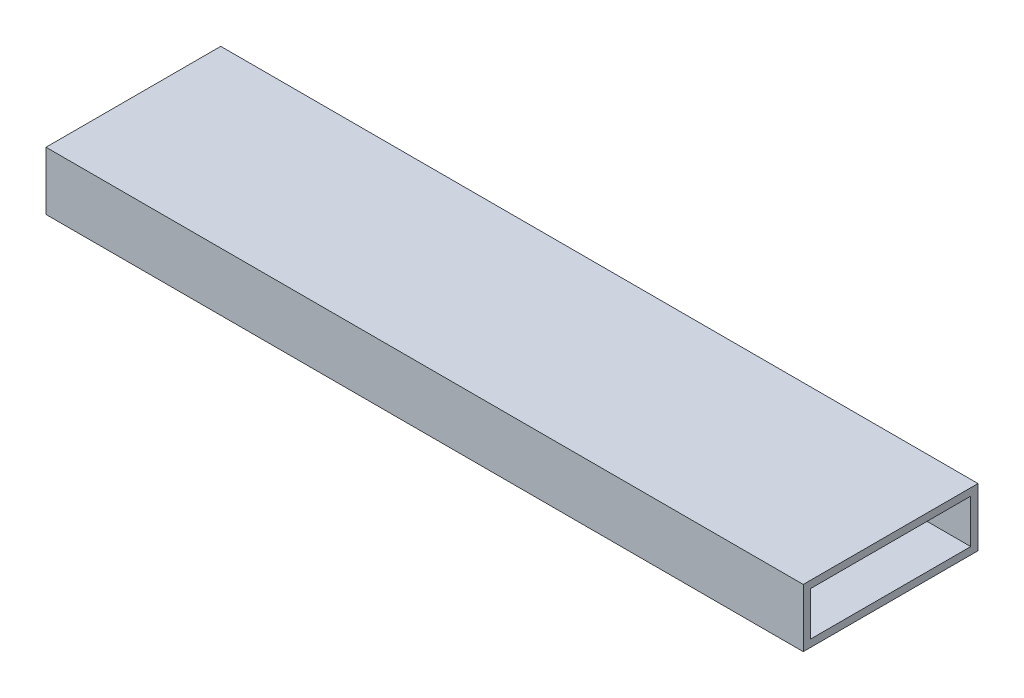
ISO-10303-21;
HEADER;
FILE_DESCRIPTION(('STEP AP214'),'2;1');
FILE_NAME('part.step','',(''),(''),'','','');
FILE_SCHEMA(('AUTOMOTIVE_DESIGN { 1 0 10303 214 1 1 1 1 }'));
ENDSEC;
DATA;
#1=APPLICATION_CONTEXT('core data for automotive mechanical design processes');
#2=APPLICATION_PROTOCOL_DEFINITION('international standard','automotive_design',2000,#1);
#3=PRODUCT_CONTEXT('',#1,'mechanical');
#4=PRODUCT('Part','Part','',(#3));
#5=PRODUCT_RELATED_PRODUCT_CATEGORY('part','',(#4));
#6=PRODUCT_DEFINITION_FORMATION('','',#4);
#7=PRODUCT_DEFINITION_CONTEXT('part definition',#1,'design');
#8=PRODUCT_DEFINITION('design','',#6,#7);
#9=PRODUCT_DEFINITION_SHAPE('','',#8);
#10=(LENGTH_UNIT() NAMED_UNIT(*) SI_UNIT(.MILLI.,.METRE.));
#11=(NAMED_UNIT(*) PLANE_ANGLE_UNIT() SI_UNIT($,.RADIAN.));
#12=(NAMED_UNIT(*) SI_UNIT($,.STERADIAN.) SOLID_ANGLE_UNIT());
#13=UNCERTAINTY_MEASURE_WITH_UNIT(LENGTH_MEASURE(1.E-05),#10,'distance_accuracy_value','');
#14=(GEOMETRIC_REPRESENTATION_CONTEXT(3) GLOBAL_UNCERTAINTY_ASSIGNED_CONTEXT((#13)) GLOBAL_UNIT_ASSIGNED_CONTEXT((#10,
#11,#12)) REPRESENTATION_CONTEXT('',''));
#15=CARTESIAN_POINT('',(0.,0.,0.));
#16=DIRECTION('',(0.,0.,1.));
#17=DIRECTION('',(1.,0.,0.));
#18=AXIS2_PLACEMENT_3D('',#15,#16,#17);
#19=CARTESIAN_POINT('',(330.2,-6.04983741483047,2.03275428475536));
#20=DIRECTION('',(0.,0.,-1.));
#21=DIRECTION('',(-1.,0.,0.));
#22=AXIS2_PLACEMENT_3D('',#19,#20,#21);
#23=PLANE('',#22);
#24=DIRECTION('',(0.,-1.,0.));
#25=VECTOR('',#24,1.);
#26=CARTESIAN_POINT('',(0.,-6.04983741483047,2.03275428475536));
#27=LINE('',#26,#25);
#28=CARTESIAN_POINT('',(0.,19.3501625851695,2.03275428475536));
#29=VERTEX_POINT('',#28);
#30=CARTESIAN_POINT('',(0.,-6.04983741483047,2.03275428475536));
#31=VERTEX_POINT('',#30);
#32=EDGE_CURVE('E130',#29,#31,#27,.T.);
#33=ORIENTED_EDGE('',*,*,#32,.T.);
#34=DIRECTION('',(-1.,0.,0.));
#35=VECTOR('',#34,1.);
#36=CARTESIAN_POINT('',(330.2,-6.04983741483047,2.03275428475536));
#37=LINE('',#36,#35);
#38=CARTESIAN_POINT('',(330.2,-6.04983741483047,2.03275428475536));
#39=VERTEX_POINT('',#38);
#40=EDGE_CURVE('E11',#39,#31,#37,.T.);
#41=ORIENTED_EDGE('',*,*,#40,.F.);
#42=DIRECTION('',(0.,-1.,0.));
#43=VECTOR('',#42,1.);
#44=CARTESIAN_POINT('',(330.2,-6.04983741483047,2.03275428475536));
#45=LINE('',#44,#43);
#46=CARTESIAN_POINT('',(330.2,19.3501625851695,2.03275428475536));
#47=VERTEX_POINT('',#46);
#48=EDGE_CURVE('E134',#47,#39,#45,.T.);
#49=ORIENTED_EDGE('',*,*,#48,.F.);
#50=DIRECTION('',(-1.,0.,0.));
#51=VECTOR('',#50,1.);
#52=CARTESIAN_POINT('',(330.2,19.3501625851695,2.03275428475536));
#53=LINE('',#52,#51);
#54=EDGE_CURVE('E144',#47,#29,#53,.T.);
#55=ORIENTED_EDGE('',*,*,#54,.T.);
#56=EDGE_LOOP('',(#33,#41,#49,#55));
#57=FACE_BOUND('',#56,.T.);
#58=ADVANCED_FACE('F33',(#57),#23,.F.);
#59=CARTESIAN_POINT('',(330.2,-6.04983741483047,2.03275428475536));
#60=DIRECTION('',(0.,1.,0.));
#61=DIRECTION('',(0.,0.,1.));
#62=AXIS2_PLACEMENT_3D('',#59,#60,#61);
#63=PLANE('',#62);
#64=DIRECTION('',(0.,0.,-1.));
#65=VECTOR('',#64,1.);
#66=CARTESIAN_POINT('',(0.,-6.04983741483047,2.03275428475536));
#67=LINE('',#66,#65);
#68=CARTESIAN_POINT('',(0.,-6.04983741483047,-74.1672457152446));
#69=VERTEX_POINT('',#68);
#70=EDGE_CURVE('E147',#31,#69,#67,.T.);
#71=ORIENTED_EDGE('',*,*,#70,.T.);
#72=DIRECTION('',(-1.,0.,0.));
#73=VECTOR('',#72,1.);
#74=CARTESIAN_POINT('',(330.2,-6.04983741483047,-74.1672457152446));
#75=LINE('',#74,#73);
#76=CARTESIAN_POINT('',(330.2,-6.04983741483047,-74.1672457152446));
#77=VERTEX_POINT('',#76);
#78=EDGE_CURVE('E40',#77,#69,#75,.T.);
#79=ORIENTED_EDGE('',*,*,#78,.F.);
#80=DIRECTION('',(0.,0.,-1.));
#81=VECTOR('',#80,1.);
#82=CARTESIAN_POINT('',(330.2,-6.04983741483047,2.03275428475536));
#83=LINE('',#82,#81);
#84=EDGE_CURVE('E137',#39,#77,#83,.T.);
#85=ORIENTED_EDGE('',*,*,#84,.F.);
#86=ORIENTED_EDGE('',*,*,#40,.T.);
#87=EDGE_LOOP('',(#71,#79,#85,#86));
#88=FACE_BOUND('',#87,.T.);
#89=ADVANCED_FACE('F175',(#88),#63,.F.);
#90=CARTESIAN_POINT('',(330.2,-6.04983741483047,-74.1672457152446));
#91=DIRECTION('',(0.,0.,1.));
#92=DIRECTION('',(1.,0.,0.));
#93=AXIS2_PLACEMENT_3D('',#90,#91,#92);
#94=PLANE('',#93);
#95=DIRECTION('',(0.,1.,0.));
#96=VECTOR('',#95,1.);
#97=CARTESIAN_POINT('',(0.,-6.04983741483047,-74.1672457152446));
#98=LINE('',#97,#96);
#99=CARTESIAN_POINT('',(0.,19.3501625851695,-74.1672457152446));
#100=VERTEX_POINT('',#99);
#101=EDGE_CURVE('E149',#69,#100,#98,.T.);
#102=ORIENTED_EDGE('',*,*,#101,.T.);
#103=DIRECTION('',(-1.,0.,0.));
#104=VECTOR('',#103,1.);
#105=CARTESIAN_POINT('',(330.2,19.3501625851695,-74.1672457152446));
#106=LINE('',#105,#104);
#107=CARTESIAN_POINT('',(330.2,19.3501625851695,-74.1672457152446));
#108=VERTEX_POINT('',#107);
#109=EDGE_CURVE('E154',#108,#100,#106,.T.);
#110=ORIENTED_EDGE('',*,*,#109,.F.);
#111=DIRECTION('',(0.,1.,0.));
#112=VECTOR('',#111,1.);
#113=CARTESIAN_POINT('',(330.2,-6.04983741483047,-74.1672457152446));
#114=LINE('',#113,#112);
#115=EDGE_CURVE('E140',#77,#108,#114,.T.);
#116=ORIENTED_EDGE('',*,*,#115,.F.);
#117=ORIENTED_EDGE('',*,*,#78,.T.);
#118=EDGE_LOOP('',(#102,#110,#116,#117));
#119=FACE_BOUND('',#118,.T.);
#120=ADVANCED_FACE('F161',(#119),#94,.F.);
#121=CARTESIAN_POINT('',(330.2,19.3501625851695,2.03275428475536));
#122=DIRECTION('',(0.,-1.,0.));
#123=DIRECTION('',(0.,0.,-1.));
#124=AXIS2_PLACEMENT_3D('',#121,#122,#123);
#125=PLANE('',#124);
#126=DIRECTION('',(0.,0.,1.));
#127=VECTOR('',#126,1.);
#128=CARTESIAN_POINT('',(0.,19.3501625851695,2.03275428475536));
#129=LINE('',#128,#127);
#130=EDGE_CURVE('E138',#100,#29,#129,.T.);
#131=ORIENTED_EDGE('',*,*,#130,.T.);
#132=ORIENTED_EDGE('',*,*,#54,.F.);
#133=DIRECTION('',(0.,0.,1.));
#134=VECTOR('',#133,1.);
#135=CARTESIAN_POINT('',(330.2,19.3501625851695,2.03275428475536));
#136=LINE('',#135,#134);
#137=EDGE_CURVE('E142',#108,#47,#136,.T.);
#138=ORIENTED_EDGE('',*,*,#137,.F.);
#139=ORIENTED_EDGE('',*,*,#109,.T.);
#140=EDGE_LOOP('',(#131,#132,#138,#139));
#141=FACE_BOUND('',#140,.T.);
#142=ADVANCED_FACE('F170',(#141),#125,.F.);
#143=CARTESIAN_POINT('',(330.2,0.,0.));
#144=DIRECTION('',(-1.,0.,0.));
#145=DIRECTION('',(0.,0.,1.));
#146=AXIS2_PLACEMENT_3D('',#143,#144,#145);
#147=PLANE('',#146);
#148=DIRECTION('',(0.,0.,-1.));
#149=VECTOR('',#148,1.);
#150=CARTESIAN_POINT('',(330.2,16.1751625851695,-70.9922457152446));
#151=LINE('',#150,#149);
#152=CARTESIAN_POINT('',(330.2,16.1751625851695,-1.14224571524464));
#153=VERTEX_POINT('',#152);
#154=CARTESIAN_POINT('',(330.2,16.1751625851695,-70.9922457152446));
#155=VERTEX_POINT('',#154);
#156=EDGE_CURVE('E105',#153,#155,#151,.T.);
#157=ORIENTED_EDGE('',*,*,#156,.T.);
#158=DIRECTION('',(0.,-1.,0.));
#159=VECTOR('',#158,1.);
#160=CARTESIAN_POINT('',(330.2,-2.87483741483047,-70.9922457152446));
#161=LINE('',#160,#159);
#162=CARTESIAN_POINT('',(330.2,-2.87483741483047,-70.9922457152446));
#163=VERTEX_POINT('',#162);
#164=EDGE_CURVE('E99',#155,#163,#161,.T.);
#165=ORIENTED_EDGE('',*,*,#164,.T.);
#166=DIRECTION('',(0.,0.,1.));
#167=VECTOR('',#166,1.);
#168=CARTESIAN_POINT('',(330.2,-2.87483741483047,-70.9922457152446));
#169=LINE('',#168,#167);
#170=CARTESIAN_POINT('',(330.2,-2.87483741483047,-1.14224571524464));
#171=VERTEX_POINT('',#170);
#172=EDGE_CURVE('E108',#163,#171,#169,.T.);
#173=ORIENTED_EDGE('',*,*,#172,.T.);
#174=DIRECTION('',(0.,1.,0.));
#175=VECTOR('',#174,1.);
#176=CARTESIAN_POINT('',(330.2,-2.87483741483047,-1.14224571524464));
#177=LINE('',#176,#175);
#178=EDGE_CURVE('E47',#171,#153,#177,.T.);
#179=ORIENTED_EDGE('',*,*,#178,.T.);
#180=EDGE_LOOP('',(#157,#165,#173,#179));
#181=FACE_BOUND('',#180,.T.);
#182=ORIENTED_EDGE('',*,*,#48,.T.);
#183=ORIENTED_EDGE('',*,*,#84,.T.);
#184=ORIENTED_EDGE('',*,*,#115,.T.);
#185=ORIENTED_EDGE('',*,*,#137,.T.);
#186=EDGE_LOOP('',(#182,#183,#184,#185));
#187=FACE_BOUND('',#186,.T.);
#188=ADVANCED_FACE('F112',(#181,#187),#147,.F.);
#189=CARTESIAN_POINT('',(0.,0.,0.));
#190=DIRECTION('',(-1.,0.,0.));
#191=DIRECTION('',(0.,0.,1.));
#192=AXIS2_PLACEMENT_3D('',#189,#190,#191);
#193=PLANE('',#192);
#194=DIRECTION('',(0.,-1.,0.));
#195=VECTOR('',#194,1.);
#196=CARTESIAN_POINT('',(0.,-2.87483741483047,-70.9922457152446));
#197=LINE('',#196,#195);
#198=CARTESIAN_POINT('',(0.,16.1751625851695,-70.9922457152446));
#199=VERTEX_POINT('',#198);
#200=CARTESIAN_POINT('',(0.,-2.87483741483047,-70.9922457152446));
#201=VERTEX_POINT('',#200);
#202=EDGE_CURVE('E55',#199,#201,#197,.T.);
#203=ORIENTED_EDGE('',*,*,#202,.F.);
#204=DIRECTION('',(0.,0.,-1.));
#205=VECTOR('',#204,1.);
#206=CARTESIAN_POINT('',(0.,16.1751625851695,-70.9922457152446));
#207=LINE('',#206,#205);
#208=CARTESIAN_POINT('',(0.,16.1751625851695,-1.14224571524464));
#209=VERTEX_POINT('',#208);
#210=EDGE_CURVE('E115',#209,#199,#207,.T.);
#211=ORIENTED_EDGE('',*,*,#210,.F.);
#212=DIRECTION('',(0.,1.,0.));
#213=VECTOR('',#212,1.);
#214=CARTESIAN_POINT('',(0.,-2.87483741483047,-1.14224571524464));
#215=LINE('',#214,#213);
#216=CARTESIAN_POINT('',(0.,-2.87483741483047,-1.14224571524464));
#217=VERTEX_POINT('',#216);
#218=EDGE_CURVE('E118',#217,#209,#215,.T.);
#219=ORIENTED_EDGE('',*,*,#218,.F.);
#220=DIRECTION('',(0.,0.,1.));
#221=VECTOR('',#220,1.);
#222=CARTESIAN_POINT('',(0.,-2.87483741483047,-70.9922457152446));
#223=LINE('',#222,#221);
#224=EDGE_CURVE('E124',#201,#217,#223,.T.);
#225=ORIENTED_EDGE('',*,*,#224,.F.);
#226=EDGE_LOOP('',(#203,#211,#219,#225));
#227=FACE_BOUND('',#226,.T.);
#228=ORIENTED_EDGE('',*,*,#32,.F.);
#229=ORIENTED_EDGE('',*,*,#130,.F.);
#230=ORIENTED_EDGE('',*,*,#101,.F.);
#231=ORIENTED_EDGE('',*,*,#70,.F.);
#232=EDGE_LOOP('',(#228,#229,#230,#231));
#233=FACE_BOUND('',#232,.T.);
#234=ADVANCED_FACE('F167',(#227,#233),#193,.T.);
#235=CARTESIAN_POINT('',(330.2,-2.87483741483047,-70.9922457152446));
#236=DIRECTION('',(0.,0.,-1.));
#237=DIRECTION('',(-1.,0.,0.));
#238=AXIS2_PLACEMENT_3D('',#235,#236,#237);
#239=PLANE('',#238);
#240=ORIENTED_EDGE('',*,*,#202,.T.);
#241=DIRECTION('',(-1.,0.,0.));
#242=VECTOR('',#241,1.);
#243=CARTESIAN_POINT('',(330.2,-2.87483741483047,-70.9922457152446));
#244=LINE('',#243,#242);
#245=EDGE_CURVE('E95',#163,#201,#244,.T.);
#246=ORIENTED_EDGE('',*,*,#245,.F.);
#247=ORIENTED_EDGE('',*,*,#164,.F.);
#248=DIRECTION('',(-1.,0.,0.));
#249=VECTOR('',#248,1.);
#250=CARTESIAN_POINT('',(330.2,16.1751625851695,-70.9922457152446));
#251=LINE('',#250,#249);
#252=EDGE_CURVE('E128',#155,#199,#251,.T.);
#253=ORIENTED_EDGE('',*,*,#252,.T.);
#254=EDGE_LOOP('',(#240,#246,#247,#253));
#255=FACE_BOUND('',#254,.T.);
#256=ADVANCED_FACE('F97',(#255),#239,.F.);
#257=CARTESIAN_POINT('',(330.2,16.1751625851695,-70.9922457152446));
#258=DIRECTION('',(0.,1.,0.));
#259=DIRECTION('',(0.,0.,1.));
#260=AXIS2_PLACEMENT_3D('',#257,#258,#259);
#261=PLANE('',#260);
#262=ORIENTED_EDGE('',*,*,#210,.T.);
#263=ORIENTED_EDGE('',*,*,#252,.F.);
#264=ORIENTED_EDGE('',*,*,#156,.F.);
#265=DIRECTION('',(-1.,0.,0.));
#266=VECTOR('',#265,1.);
#267=CARTESIAN_POINT('',(330.2,16.1751625851695,-1.14224571524464));
#268=LINE('',#267,#266);
#269=EDGE_CURVE('E131',#153,#209,#268,.T.);
#270=ORIENTED_EDGE('',*,*,#269,.T.);
#271=EDGE_LOOP('',(#262,#263,#264,#270));
#272=FACE_BOUND('',#271,.T.);
#273=ADVANCED_FACE('F192',(#272),#261,.F.);
#274=CARTESIAN_POINT('',(330.2,-2.87483741483047,-1.14224571524464));
#275=DIRECTION('',(0.,0.,1.));
#276=DIRECTION('',(1.,0.,0.));
#277=AXIS2_PLACEMENT_3D('',#274,#275,#276);
#278=PLANE('',#277);
#279=ORIENTED_EDGE('',*,*,#218,.T.);
#280=ORIENTED_EDGE('',*,*,#269,.F.);
#281=ORIENTED_EDGE('',*,*,#178,.F.);
#282=DIRECTION('',(-1.,0.,0.));
#283=VECTOR('',#282,1.);
#284=CARTESIAN_POINT('',(330.2,-2.87483741483047,-1.14224571524464));
#285=LINE('',#284,#283);
#286=EDGE_CURVE('E104',#171,#217,#285,.T.);
#287=ORIENTED_EDGE('',*,*,#286,.T.);
#288=EDGE_LOOP('',(#279,#280,#281,#287));
#289=FACE_BOUND('',#288,.T.);
#290=ADVANCED_FACE('F195',(#289),#278,.F.);
#291=CARTESIAN_POINT('',(330.2,-2.87483741483047,-70.9922457152446));
#292=DIRECTION('',(0.,-1.,0.));
#293=DIRECTION('',(0.,0.,-1.));
#294=AXIS2_PLACEMENT_3D('',#291,#292,#293);
#295=PLANE('',#294);
#296=ORIENTED_EDGE('',*,*,#224,.T.);
#297=ORIENTED_EDGE('',*,*,#286,.F.);
#298=ORIENTED_EDGE('',*,*,#172,.F.);
#299=ORIENTED_EDGE('',*,*,#245,.T.);
#300=EDGE_LOOP('',(#296,#297,#298,#299));
#301=FACE_BOUND('',#300,.T.);
#302=ADVANCED_FACE('F109',(#301),#295,.F.);
#303=CLOSED_SHELL('',(#58,#89,#120,#142,#188,#234,#256,#273,#290,#302));
#304=MANIFOLD_SOLID_BREP('B2',#303);
#305=ADVANCED_BREP_SHAPE_REPRESENTATION('',(#18,#304),#14);
#306=SHAPE_DEFINITION_REPRESENTATION(#9,#305);
ENDSEC;
END-ISO-10303-21;
